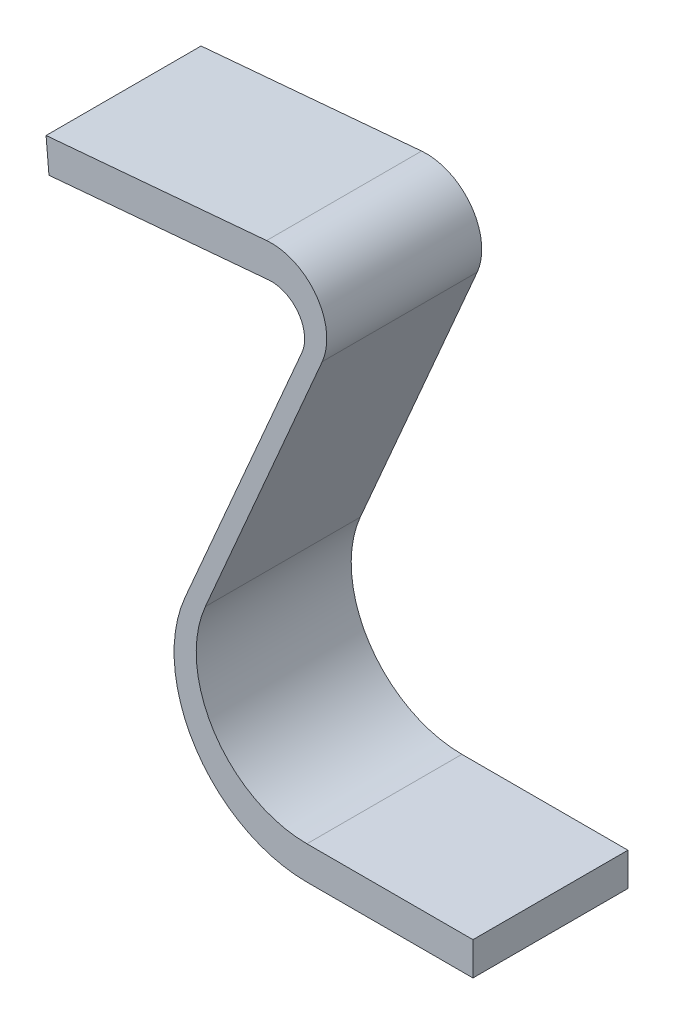
ISO-10303-21;
HEADER;
FILE_DESCRIPTION(('STEP AP214'),'2;1');
FILE_NAME('part.step','',(''),(''),'','','');
FILE_SCHEMA(('AUTOMOTIVE_DESIGN { 1 0 10303 214 1 1 1 1 }'));
ENDSEC;
DATA;
#1=APPLICATION_CONTEXT('core data for automotive mechanical design processes');
#2=APPLICATION_PROTOCOL_DEFINITION('international standard','automotive_design',2000,#1);
#3=PRODUCT_CONTEXT('',#1,'mechanical');
#4=PRODUCT('Part','Part','',(#3));
#5=PRODUCT_RELATED_PRODUCT_CATEGORY('part','',(#4));
#6=PRODUCT_DEFINITION_FORMATION('','',#4);
#7=PRODUCT_DEFINITION_CONTEXT('part definition',#1,'design');
#8=PRODUCT_DEFINITION('design','',#6,#7);
#9=PRODUCT_DEFINITION_SHAPE('','',#8);
#10=(LENGTH_UNIT() NAMED_UNIT(*) SI_UNIT(.MILLI.,.METRE.));
#11=(NAMED_UNIT(*) PLANE_ANGLE_UNIT() SI_UNIT($,.RADIAN.));
#12=(NAMED_UNIT(*) SI_UNIT($,.STERADIAN.) SOLID_ANGLE_UNIT());
#13=UNCERTAINTY_MEASURE_WITH_UNIT(LENGTH_MEASURE(1.E-05),#10,'distance_accuracy_value','');
#14=(GEOMETRIC_REPRESENTATION_CONTEXT(3) GLOBAL_UNCERTAINTY_ASSIGNED_CONTEXT((#13)) GLOBAL_UNIT_ASSIGNED_CONTEXT((#10,
#11,#12)) REPRESENTATION_CONTEXT('',''));
#15=CARTESIAN_POINT('',(0.,0.,0.));
#16=DIRECTION('',(0.,0.,1.));
#17=DIRECTION('',(1.,0.,0.));
#18=AXIS2_PLACEMENT_3D('',#15,#16,#17);
#19=CARTESIAN_POINT('',(-17.4584181552045,-11.3648480796005,-7.));
#20=DIRECTION('',(-0.996194698091746,-0.087155742747657,0.));
#21=DIRECTION('',(0.087155742747657,-0.996194698091746,0.));
#22=AXIS2_PLACEMENT_3D('',#19,#20,#21);
#23=PLANE('',#22);
#24=DIRECTION('',(0.,0.,1.));
#25=VECTOR('',#24,1.);
#26=CARTESIAN_POINT('',(-17.1972825808757,-14.34964135229,-7.));
#27=LINE('',#26,#25);
#28=CARTESIAN_POINT('',(-17.1972825808757,-14.34964135229,-7.));
#29=VERTEX_POINT('',#28);
#30=CARTESIAN_POINT('',(-17.1972825808757,-14.34964135229,7.));
#31=VERTEX_POINT('',#30);
#32=EDGE_CURVE('E33',#29,#31,#27,.T.);
#33=ORIENTED_EDGE('',*,*,#32,.T.);
#34=DIRECTION('',(0.087155742747657,-0.996194698091746,0.));
#35=VECTOR('',#34,1.);
#36=CARTESIAN_POINT('',(-17.4584181552045,-11.3648480796005,7.));
#37=LINE('',#36,#35);
#38=CARTESIAN_POINT('',(-17.4584181552045,-11.3648480796005,7.));
#39=VERTEX_POINT('',#38);
#40=EDGE_CURVE('E118',#39,#31,#37,.T.);
#41=ORIENTED_EDGE('',*,*,#40,.F.);
#42=DIRECTION('',(0.,0.,1.));
#43=VECTOR('',#42,1.);
#44=CARTESIAN_POINT('',(-17.4584181552045,-11.3648480796005,-7.));
#45=LINE('',#44,#43);
#46=CARTESIAN_POINT('',(-17.4584181552045,-11.3648480796005,-7.));
#47=VERTEX_POINT('',#46);
#48=EDGE_CURVE('E11',#47,#39,#45,.T.);
#49=ORIENTED_EDGE('',*,*,#48,.F.);
#50=DIRECTION('',(0.087155742747657,-0.996194698091746,0.));
#51=VECTOR('',#50,1.);
#52=CARTESIAN_POINT('',(-17.4584181552045,-11.3648480796005,-7.));
#53=LINE('',#52,#51);
#54=EDGE_CURVE('E119',#47,#29,#53,.T.);
#55=ORIENTED_EDGE('',*,*,#54,.T.);
#56=EDGE_LOOP('',(#33,#41,#49,#55));
#57=FACE_BOUND('',#56,.T.);
#58=ADVANCED_FACE('F30',(#57),#23,.T.);
#59=CARTESIAN_POINT('',(-17.4584181552045,-11.3648480796005,-7.));
#60=DIRECTION('',(-0.0871557427476629,0.996194698091745,0.));
#61=DIRECTION('',(-0.996194698091745,-0.0871557427476629,0.));
#62=AXIS2_PLACEMENT_3D('',#59,#60,#61);
#63=PLANE('',#62);
#64=ORIENTED_EDGE('',*,*,#48,.T.);
#65=DIRECTION('',(-0.996194698091745,-0.0871557427476629,0.));
#66=VECTOR('',#65,1.);
#67=CARTESIAN_POINT('',(-17.4584181552045,-11.3648480796005,7.));
#68=LINE('',#67,#66);
#69=CARTESIAN_POINT('',(2.46547580663017,-9.62173322464723,7.));
#70=VERTEX_POINT('',#69);
#71=EDGE_CURVE('E136',#70,#39,#68,.T.);
#72=ORIENTED_EDGE('',*,*,#71,.F.);
#73=DIRECTION('',(0.,0.,1.));
#74=VECTOR('',#73,1.);
#75=CARTESIAN_POINT('',(2.46547580663017,-9.62173322464723,-7.));
#76=LINE('',#75,#74);
#77=CARTESIAN_POINT('',(2.46547580663017,-9.62173322464723,-7.));
#78=VERTEX_POINT('',#77);
#79=EDGE_CURVE('E38',#78,#70,#76,.T.);
#80=ORIENTED_EDGE('',*,*,#79,.F.);
#81=DIRECTION('',(-0.996194698091745,-0.0871557427476629,0.));
#82=VECTOR('',#81,1.);
#83=CARTESIAN_POINT('',(-17.4584181552045,-11.3648480796005,-7.));
#84=LINE('',#83,#82);
#85=EDGE_CURVE('E124',#78,#47,#84,.T.);
#86=ORIENTED_EDGE('',*,*,#85,.T.);
#87=EDGE_LOOP('',(#64,#72,#80,#86));
#88=FACE_BOUND('',#87,.T.);
#89=ADVANCED_FACE('F248',(#88),#63,.T.);
#90=CARTESIAN_POINT('',(2.90125452036853,-14.602706715106,-7.));
#91=DIRECTION('',(0.,0.,1.));
#92=DIRECTION('',(1.,0.,0.));
#93=AXIS2_PLACEMENT_3D('',#90,#91,#92);
#94=CYLINDRICAL_SURFACE('',#93,4.99999999999997);
#95=ORIENTED_EDGE('',*,*,#79,.T.);
#96=CARTESIAN_POINT('',(2.90125452036853,-14.602706715106,7.));
#97=DIRECTION('',(0.,0.,1.));
#98=DIRECTION('',(1.,0.,0.));
#99=AXIS2_PLACEMENT_3D('',#96,#97,#98);
#100=CIRCLE('',#99,4.99999999999997);
#101=CARTESIAN_POINT('',(7.49108595619679,-16.5859987739522,7.));
#102=VERTEX_POINT('',#101);
#103=EDGE_CURVE('E161',#102,#70,#100,.T.);
#104=ORIENTED_EDGE('',*,*,#103,.F.);
#105=DIRECTION('',(0.,0.,1.));
#106=VECTOR('',#105,1.);
#107=CARTESIAN_POINT('',(7.49108595619679,-16.5859987739522,-7.));
#108=LINE('',#107,#106);
#109=CARTESIAN_POINT('',(7.49108595619679,-16.5859987739522,-7.));
#110=VERTEX_POINT('',#109);
#111=EDGE_CURVE('E195',#110,#102,#108,.T.);
#112=ORIENTED_EDGE('',*,*,#111,.F.);
#113=CARTESIAN_POINT('',(2.90125452036853,-14.602706715106,-7.));
#114=DIRECTION('',(0.,0.,1.));
#115=DIRECTION('',(1.,0.,0.));
#116=AXIS2_PLACEMENT_3D('',#113,#114,#115);
#117=CIRCLE('',#116,4.99999999999997);
#118=EDGE_CURVE('E191',#110,#78,#117,.T.);
#119=ORIENTED_EDGE('',*,*,#118,.T.);
#120=EDGE_LOOP('',(#95,#104,#112,#119));
#121=FACE_BOUND('',#120,.T.);
#122=ADVANCED_FACE('F246',(#121),#94,.T.);
#123=CARTESIAN_POINT('',(7.49108595619676,-16.5859987739522,-7.));
#124=DIRECTION('',(0.917966287165638,-0.396658411769288,0.));
#125=DIRECTION('',(0.396658411769288,0.917966287165638,0.));
#126=AXIS2_PLACEMENT_3D('',#123,#124,#125);
#127=PLANE('',#126);
#128=ORIENTED_EDGE('',*,*,#111,.T.);
#129=DIRECTION('',(0.396658411769288,0.917966287165638,0.));
#130=VECTOR('',#129,1.);
#131=CARTESIAN_POINT('',(7.49108595619676,-16.5859987739522,7.));
#132=LINE('',#131,#130);
#133=CARTESIAN_POINT('',(-3.07278090649949,-41.0334158823071,7.));
#134=VERTEX_POINT('',#133);
#135=EDGE_CURVE('E158',#134,#102,#132,.T.);
#136=ORIENTED_EDGE('',*,*,#135,.F.);
#137=DIRECTION('',(0.,0.,1.));
#138=VECTOR('',#137,1.);
#139=CARTESIAN_POINT('',(-3.07278090649949,-41.0334158823071,-7.));
#140=LINE('',#139,#138);
#141=CARTESIAN_POINT('',(-3.07278090649949,-41.0334158823071,-7.));
#142=VERTEX_POINT('',#141);
#143=EDGE_CURVE('E197',#142,#134,#140,.T.);
#144=ORIENTED_EDGE('',*,*,#143,.F.);
#145=DIRECTION('',(0.396658411769288,0.917966287165638,0.));
#146=VECTOR('',#145,1.);
#147=CARTESIAN_POINT('',(7.49108595619676,-16.5859987739522,-7.));
#148=LINE('',#147,#146);
#149=EDGE_CURVE('E188',#142,#110,#148,.T.);
#150=ORIENTED_EDGE('',*,*,#149,.T.);
#151=EDGE_LOOP('',(#128,#136,#144,#150));
#152=FACE_BOUND('',#151,.T.);
#153=ADVANCED_FACE('F244',(#152),#127,.T.);
#154=CARTESIAN_POINT('',(6.10688196515687,-45.,-7.));
#155=DIRECTION('',(0.,0.,1.));
#156=DIRECTION('',(1.,0.,0.));
#157=AXIS2_PLACEMENT_3D('',#154,#155,#156);
#158=CYLINDRICAL_SURFACE('',#157,10.);
#159=ORIENTED_EDGE('',*,*,#143,.T.);
#160=CARTESIAN_POINT('',(6.10688196515687,-45.,7.));
#161=DIRECTION('',(0.,0.,-1.));
#162=DIRECTION('',(-1.,0.,0.));
#163=AXIS2_PLACEMENT_3D('',#160,#161,#162);
#164=CIRCLE('',#163,10.);
#165=CARTESIAN_POINT('',(6.10688196515687,-55.,7.));
#166=VERTEX_POINT('',#165);
#167=EDGE_CURVE('E155',#166,#134,#164,.T.);
#168=ORIENTED_EDGE('',*,*,#167,.F.);
#169=DIRECTION('',(0.,0.,1.));
#170=VECTOR('',#169,1.);
#171=CARTESIAN_POINT('',(6.10688196515687,-55.,-7.));
#172=LINE('',#171,#170);
#173=CARTESIAN_POINT('',(6.10688196515687,-55.,-7.));
#174=VERTEX_POINT('',#173);
#175=EDGE_CURVE('E199',#174,#166,#172,.T.);
#176=ORIENTED_EDGE('',*,*,#175,.F.);
#177=CARTESIAN_POINT('',(6.10688196515687,-45.,-7.));
#178=DIRECTION('',(0.,0.,-1.));
#179=DIRECTION('',(-1.,0.,0.));
#180=AXIS2_PLACEMENT_3D('',#177,#178,#179);
#181=CIRCLE('',#180,10.);
#182=EDGE_CURVE('E185',#174,#142,#181,.T.);
#183=ORIENTED_EDGE('',*,*,#182,.T.);
#184=EDGE_LOOP('',(#159,#168,#176,#183));
#185=FACE_BOUND('',#184,.T.);
#186=ADVANCED_FACE('F239',(#185),#158,.F.);
#187=CARTESIAN_POINT('',(6.10688196515687,-55.,-7.));
#188=DIRECTION('',(0.,1.,0.));
#189=DIRECTION('',(-1.,0.,0.));
#190=AXIS2_PLACEMENT_3D('',#187,#188,#189);
#191=PLANE('',#190);
#192=ORIENTED_EDGE('',*,*,#175,.T.);
#193=DIRECTION('',(-1.,0.,0.));
#194=VECTOR('',#193,1.);
#195=CARTESIAN_POINT('',(6.10688196515687,-55.,7.));
#196=LINE('',#195,#194);
#197=CARTESIAN_POINT('',(21.1068819651569,-55.,7.));
#198=VERTEX_POINT('',#197);
#199=EDGE_CURVE('E152',#198,#166,#196,.T.);
#200=ORIENTED_EDGE('',*,*,#199,.F.);
#201=DIRECTION('',(0.,0.,1.));
#202=VECTOR('',#201,1.);
#203=CARTESIAN_POINT('',(21.1068819651569,-55.,-7.));
#204=LINE('',#203,#202);
#205=CARTESIAN_POINT('',(21.1068819651569,-55.,-7.));
#206=VERTEX_POINT('',#205);
#207=EDGE_CURVE('E201',#206,#198,#204,.T.);
#208=ORIENTED_EDGE('',*,*,#207,.F.);
#209=DIRECTION('',(-1.,0.,0.));
#210=VECTOR('',#209,1.);
#211=CARTESIAN_POINT('',(6.10688196515687,-55.,-7.));
#212=LINE('',#211,#210);
#213=EDGE_CURVE('E182',#206,#174,#212,.T.);
#214=ORIENTED_EDGE('',*,*,#213,.T.);
#215=EDGE_LOOP('',(#192,#200,#208,#214));
#216=FACE_BOUND('',#215,.T.);
#217=ADVANCED_FACE('F234',(#216),#191,.T.);
#218=CARTESIAN_POINT('',(21.1068819651569,-55.,-7.));
#219=DIRECTION('',(1.,0.,0.));
#220=DIRECTION('',(0.,0.,-1.));
#221=AXIS2_PLACEMENT_3D('',#218,#219,#220);
#222=PLANE('',#221);
#223=ORIENTED_EDGE('',*,*,#207,.T.);
#224=DIRECTION('',(0.,1.,0.));
#225=VECTOR('',#224,1.);
#226=CARTESIAN_POINT('',(21.1068819651569,-55.,7.));
#227=LINE('',#226,#225);
#228=CARTESIAN_POINT('',(21.1068819651569,-58.,7.));
#229=VERTEX_POINT('',#228);
#230=EDGE_CURVE('E149',#229,#198,#227,.T.);
#231=ORIENTED_EDGE('',*,*,#230,.F.);
#232=DIRECTION('',(0.,0.,1.));
#233=VECTOR('',#232,1.);
#234=CARTESIAN_POINT('',(21.1068819651569,-58.,-7.));
#235=LINE('',#234,#233);
#236=CARTESIAN_POINT('',(21.1068819651569,-58.,-7.));
#237=VERTEX_POINT('',#236);
#238=EDGE_CURVE('E203',#237,#229,#235,.T.);
#239=ORIENTED_EDGE('',*,*,#238,.F.);
#240=DIRECTION('',(0.,1.,0.));
#241=VECTOR('',#240,1.);
#242=CARTESIAN_POINT('',(21.1068819651569,-55.,-7.));
#243=LINE('',#242,#241);
#244=EDGE_CURVE('E179',#237,#206,#243,.T.);
#245=ORIENTED_EDGE('',*,*,#244,.T.);
#246=EDGE_LOOP('',(#223,#231,#239,#245));
#247=FACE_BOUND('',#246,.T.);
#248=ADVANCED_FACE('F232',(#247),#222,.T.);
#249=CARTESIAN_POINT('',(6.10688196515687,-58.,-7.));
#250=DIRECTION('',(0.,-1.,0.));
#251=DIRECTION('',(0.,0.,-1.));
#252=AXIS2_PLACEMENT_3D('',#249,#250,#251);
#253=PLANE('',#252);
#254=ORIENTED_EDGE('',*,*,#238,.T.);
#255=DIRECTION('',(1.,0.,0.));
#256=VECTOR('',#255,1.);
#257=CARTESIAN_POINT('',(6.10688196515687,-58.,7.));
#258=LINE('',#257,#256);
#259=CARTESIAN_POINT('',(6.10688196515687,-58.,7.));
#260=VERTEX_POINT('',#259);
#261=EDGE_CURVE('E146',#260,#229,#258,.T.);
#262=ORIENTED_EDGE('',*,*,#261,.F.);
#263=DIRECTION('',(0.,0.,1.));
#264=VECTOR('',#263,1.);
#265=CARTESIAN_POINT('',(6.10688196515687,-58.,-7.));
#266=LINE('',#265,#264);
#267=CARTESIAN_POINT('',(6.10688196515687,-58.,-7.));
#268=VERTEX_POINT('',#267);
#269=EDGE_CURVE('E205',#268,#260,#266,.T.);
#270=ORIENTED_EDGE('',*,*,#269,.F.);
#271=DIRECTION('',(1.,0.,0.));
#272=VECTOR('',#271,1.);
#273=CARTESIAN_POINT('',(6.10688196515687,-58.,-7.));
#274=LINE('',#273,#272);
#275=EDGE_CURVE('E176',#268,#237,#274,.T.);
#276=ORIENTED_EDGE('',*,*,#275,.T.);
#277=EDGE_LOOP('',(#254,#262,#270,#276));
#278=FACE_BOUND('',#277,.T.);
#279=ADVANCED_FACE('F227',(#278),#253,.T.);
#280=CARTESIAN_POINT('',(6.10688196515687,-46.,-7.));
#281=DIRECTION('',(0.,0.,1.));
#282=DIRECTION('',(1.,0.,0.));
#283=AXIS2_PLACEMENT_3D('',#280,#281,#282);
#284=CYLINDRICAL_SURFACE('',#283,12.);
#285=ORIENTED_EDGE('',*,*,#269,.T.);
#286=CARTESIAN_POINT('',(6.10688196515687,-46.,7.));
#287=DIRECTION('',(0.,0.,1.));
#288=DIRECTION('',(-1.,0.,0.));
#289=AXIS2_PLACEMENT_3D('',#286,#287,#288);
#290=CIRCLE('',#289,12.);
#291=CARTESIAN_POINT('',(-4.90871348083078,-41.2400990587685,7.));
#292=VERTEX_POINT('',#291);
#293=EDGE_CURVE('E143',#292,#260,#290,.T.);
#294=ORIENTED_EDGE('',*,*,#293,.F.);
#295=DIRECTION('',(0.,0.,1.));
#296=VECTOR('',#295,1.);
#297=CARTESIAN_POINT('',(-4.90871348083078,-41.2400990587685,-7.));
#298=LINE('',#297,#296);
#299=CARTESIAN_POINT('',(-4.90871348083078,-41.2400990587685,-7.));
#300=VERTEX_POINT('',#299);
#301=EDGE_CURVE('E207',#300,#292,#298,.T.);
#302=ORIENTED_EDGE('',*,*,#301,.F.);
#303=CARTESIAN_POINT('',(6.10688196515687,-46.,-7.));
#304=DIRECTION('',(0.,0.,1.));
#305=DIRECTION('',(-1.,0.,0.));
#306=AXIS2_PLACEMENT_3D('',#303,#304,#305);
#307=CIRCLE('',#306,12.);
#308=EDGE_CURVE('E173',#300,#268,#307,.T.);
#309=ORIENTED_EDGE('',*,*,#308,.T.);
#310=EDGE_LOOP('',(#285,#294,#302,#309));
#311=FACE_BOUND('',#310,.T.);
#312=ADVANCED_FACE('F220',(#311),#284,.T.);
#313=CARTESIAN_POINT('',(5.65515338186569,-16.7926819504137,-7.));
#314=DIRECTION('',(-0.917966287165634,0.396658411769296,0.));
#315=DIRECTION('',(-0.396658411769296,-0.917966287165634,0.));
#316=AXIS2_PLACEMENT_3D('',#313,#314,#315);
#317=PLANE('',#316);
#318=ORIENTED_EDGE('',*,*,#301,.T.);
#319=DIRECTION('',(-0.396658411769296,-0.917966287165634,0.));
#320=VECTOR('',#319,1.);
#321=CARTESIAN_POINT('',(5.65515338186569,-16.7926819504137,7.));
#322=LINE('',#321,#320);
#323=CARTESIAN_POINT('',(5.65515338186569,-16.7926819504137,7.));
#324=VERTEX_POINT('',#323);
#325=EDGE_CURVE('E140',#324,#292,#322,.T.);
#326=ORIENTED_EDGE('',*,*,#325,.F.);
#327=DIRECTION('',(0.,0.,1.));
#328=VECTOR('',#327,1.);
#329=CARTESIAN_POINT('',(5.65515338186569,-16.7926819504137,-7.));
#330=LINE('',#329,#328);
#331=CARTESIAN_POINT('',(5.65515338186569,-16.7926819504137,-7.));
#332=VERTEX_POINT('',#331);
#333=EDGE_CURVE('E209',#332,#324,#330,.T.);
#334=ORIENTED_EDGE('',*,*,#333,.F.);
#335=DIRECTION('',(-0.396658411769296,-0.917966287165634,0.));
#336=VECTOR('',#335,1.);
#337=CARTESIAN_POINT('',(5.65515338186569,-16.7926819504137,-7.));
#338=LINE('',#337,#336);
#339=EDGE_CURVE('E170',#332,#300,#338,.T.);
#340=ORIENTED_EDGE('',*,*,#339,.T.);
#341=EDGE_LOOP('',(#318,#326,#334,#340));
#342=FACE_BOUND('',#341,.T.);
#343=ADVANCED_FACE('F217',(#342),#317,.T.);
#344=CARTESIAN_POINT('',(2.9012545203686,-15.602706715106,-7.));
#345=DIRECTION('',(0.,0.,1.));
#346=DIRECTION('',(1.,0.,0.));
#347=AXIS2_PLACEMENT_3D('',#344,#345,#346);
#348=CYLINDRICAL_SURFACE('',#347,3.00000000000009);
#349=ORIENTED_EDGE('',*,*,#333,.T.);
#350=CARTESIAN_POINT('',(2.9012545203686,-15.602706715106,7.));
#351=DIRECTION('',(0.,0.,-1.));
#352=DIRECTION('',(1.,0.,0.));
#353=AXIS2_PLACEMENT_3D('',#350,#351,#352);
#354=CIRCLE('',#353,3.00000000000009);
#355=CARTESIAN_POINT('',(2.63978729212588,-12.6141226208307,7.));
#356=VERTEX_POINT('',#355);
#357=EDGE_CURVE('E131',#356,#324,#354,.T.);
#358=ORIENTED_EDGE('',*,*,#357,.F.);
#359=DIRECTION('',(0.,0.,1.));
#360=VECTOR('',#359,1.);
#361=CARTESIAN_POINT('',(2.63978729212588,-12.6141226208307,-7.));
#362=LINE('',#361,#360);
#363=CARTESIAN_POINT('',(2.63978729212588,-12.6141226208307,-7.));
#364=VERTEX_POINT('',#363);
#365=EDGE_CURVE('E123',#364,#356,#362,.T.);
#366=ORIENTED_EDGE('',*,*,#365,.F.);
#367=CARTESIAN_POINT('',(2.9012545203686,-15.602706715106,-7.));
#368=DIRECTION('',(0.,0.,-1.));
#369=DIRECTION('',(1.,0.,0.));
#370=AXIS2_PLACEMENT_3D('',#367,#368,#369);
#371=CIRCLE('',#370,3.00000000000009);
#372=EDGE_CURVE('E167',#364,#332,#371,.T.);
#373=ORIENTED_EDGE('',*,*,#372,.T.);
#374=EDGE_LOOP('',(#349,#358,#366,#373));
#375=FACE_BOUND('',#374,.T.);
#376=ADVANCED_FACE('F211',(#375),#348,.F.);
#377=CARTESIAN_POINT('',(-17.1972825808757,-14.34964135229,-7.));
#378=DIRECTION('',(0.0871557427476628,-0.996194698091745,0.));
#379=DIRECTION('',(0.996194698091745,0.0871557427476628,0.));
#380=AXIS2_PLACEMENT_3D('',#377,#378,#379);
#381=PLANE('',#380);
#382=ORIENTED_EDGE('',*,*,#365,.T.);
#383=DIRECTION('',(0.996194698091745,0.0871557427476628,0.));
#384=VECTOR('',#383,1.);
#385=CARTESIAN_POINT('',(-17.1972825808757,-14.34964135229,7.));
#386=LINE('',#385,#384);
#387=EDGE_CURVE('E126',#31,#356,#386,.T.);
#388=ORIENTED_EDGE('',*,*,#387,.F.);
#389=ORIENTED_EDGE('',*,*,#32,.F.);
#390=DIRECTION('',(0.996194698091745,0.0871557427476628,0.));
#391=VECTOR('',#390,1.);
#392=CARTESIAN_POINT('',(-17.1972825808757,-14.34964135229,-7.));
#393=LINE('',#392,#391);
#394=EDGE_CURVE('E165',#29,#364,#393,.T.);
#395=ORIENTED_EDGE('',*,*,#394,.T.);
#396=EDGE_LOOP('',(#382,#388,#389,#395));
#397=FACE_BOUND('',#396,.T.);
#398=ADVANCED_FACE('F127',(#397),#381,.T.);
#399=CARTESIAN_POINT('',(2.9012545203686,-15.602706715106,-7.));
#400=DIRECTION('',(0.,0.,1.));
#401=DIRECTION('',(1.,0.,0.));
#402=AXIS2_PLACEMENT_3D('',#399,#400,#401);
#403=PLANE('',#402);
#404=ORIENTED_EDGE('',*,*,#54,.F.);
#405=ORIENTED_EDGE('',*,*,#85,.F.);
#406=ORIENTED_EDGE('',*,*,#118,.F.);
#407=ORIENTED_EDGE('',*,*,#149,.F.);
#408=ORIENTED_EDGE('',*,*,#182,.F.);
#409=ORIENTED_EDGE('',*,*,#213,.F.);
#410=ORIENTED_EDGE('',*,*,#244,.F.);
#411=ORIENTED_EDGE('',*,*,#275,.F.);
#412=ORIENTED_EDGE('',*,*,#308,.F.);
#413=ORIENTED_EDGE('',*,*,#339,.F.);
#414=ORIENTED_EDGE('',*,*,#372,.F.);
#415=ORIENTED_EDGE('',*,*,#394,.F.);
#416=EDGE_LOOP('',(#404,#405,#406,#407,#408,#409,#410,#411,#412,#413,#414,#415));
#417=FACE_BOUND('',#416,.T.);
#418=ADVANCED_FACE('F223',(#417),#403,.F.);
#419=CARTESIAN_POINT('',(2.9012545203686,-15.602706715106,7.));
#420=DIRECTION('',(0.,0.,1.));
#421=DIRECTION('',(1.,0.,0.));
#422=AXIS2_PLACEMENT_3D('',#419,#420,#421);
#423=PLANE('',#422);
#424=ORIENTED_EDGE('',*,*,#40,.T.);
#425=ORIENTED_EDGE('',*,*,#387,.T.);
#426=ORIENTED_EDGE('',*,*,#357,.T.);
#427=ORIENTED_EDGE('',*,*,#325,.T.);
#428=ORIENTED_EDGE('',*,*,#293,.T.);
#429=ORIENTED_EDGE('',*,*,#261,.T.);
#430=ORIENTED_EDGE('',*,*,#230,.T.);
#431=ORIENTED_EDGE('',*,*,#199,.T.);
#432=ORIENTED_EDGE('',*,*,#167,.T.);
#433=ORIENTED_EDGE('',*,*,#135,.T.);
#434=ORIENTED_EDGE('',*,*,#103,.T.);
#435=ORIENTED_EDGE('',*,*,#71,.T.);
#436=EDGE_LOOP('',(#424,#425,#426,#427,#428,#429,#430,#431,#432,#433,#434,#435));
#437=FACE_BOUND('',#436,.T.);
#438=ADVANCED_FACE('F134',(#437),#423,.T.);
#439=CLOSED_SHELL('',(#58,#89,#122,#153,#186,#217,#248,#279,#312,#343,#376,#398,#418,#438));
#440=MANIFOLD_SOLID_BREP('B2',#439);
#441=ADVANCED_BREP_SHAPE_REPRESENTATION('',(#18,#440),#14);
#442=SHAPE_DEFINITION_REPRESENTATION(#9,#441);
ENDSEC;
END-ISO-10303-21;
